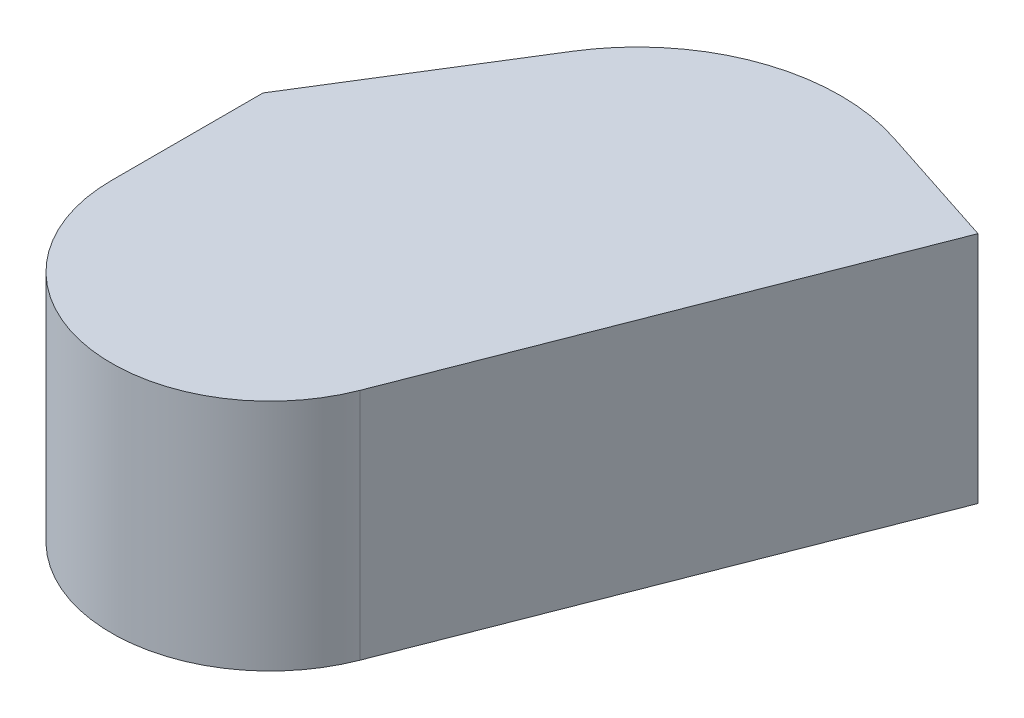
ISO-10303-21;
HEADER;
FILE_DESCRIPTION(('STEP AP214'),'2;1');
FILE_NAME('part.step','',(''),(''),'','','');
FILE_SCHEMA(('AUTOMOTIVE_DESIGN { 1 0 10303 214 1 1 1 1 }'));
ENDSEC;
DATA;
#1=APPLICATION_CONTEXT('core data for automotive mechanical design processes');
#2=APPLICATION_PROTOCOL_DEFINITION('international standard','automotive_design',2000,#1);
#3=PRODUCT_CONTEXT('',#1,'mechanical');
#4=PRODUCT('Part','Part','',(#3));
#5=PRODUCT_RELATED_PRODUCT_CATEGORY('part','',(#4));
#6=PRODUCT_DEFINITION_FORMATION('','',#4);
#7=PRODUCT_DEFINITION_CONTEXT('part definition',#1,'design');
#8=PRODUCT_DEFINITION('design','',#6,#7);
#9=PRODUCT_DEFINITION_SHAPE('','',#8);
#10=(LENGTH_UNIT() NAMED_UNIT(*) SI_UNIT(.MILLI.,.METRE.));
#11=(NAMED_UNIT(*) PLANE_ANGLE_UNIT() SI_UNIT($,.RADIAN.));
#12=(NAMED_UNIT(*) SI_UNIT($,.STERADIAN.) SOLID_ANGLE_UNIT());
#13=UNCERTAINTY_MEASURE_WITH_UNIT(LENGTH_MEASURE(1.E-05),#10,'distance_accuracy_value','');
#14=(GEOMETRIC_REPRESENTATION_CONTEXT(3) GLOBAL_UNCERTAINTY_ASSIGNED_CONTEXT((#13)) GLOBAL_UNIT_ASSIGNED_CONTEXT((#10,
#11,#12)) REPRESENTATION_CONTEXT('',''));
#15=CARTESIAN_POINT('',(0.,0.,0.));
#16=DIRECTION('',(0.,0.,1.));
#17=DIRECTION('',(1.,0.,0.));
#18=AXIS2_PLACEMENT_3D('',#15,#16,#17);
#19=CARTESIAN_POINT('',(-27.0706042753242,0.,37.8486946738408));
#20=DIRECTION('',(0.,-1.,0.));
#21=DIRECTION('',(0.,0.,-1.));
#22=AXIS2_PLACEMENT_3D('',#19,#20,#21);
#23=CYLINDRICAL_SURFACE('',#22,39.60316423643);
#24=DIRECTION('',(0.,-1.,0.));
#25=VECTOR('',#24,1.);
#26=CARTESIAN_POINT('',(-66.6737685117542,58.42,37.8486946738408));
#27=LINE('',#26,#25);
#28=CARTESIAN_POINT('',(-66.6737685117542,0.,37.8486946738408));
#29=VERTEX_POINT('',#28);
#30=CARTESIAN_POINT('',(-66.6737685117542,58.42,37.8486946738408));
#31=VERTEX_POINT('',#30);
#32=EDGE_CURVE('E106',#29,#31,#27,.F.);
#33=ORIENTED_EDGE('',*,*,#32,.F.);
#34=CARTESIAN_POINT('',(-27.0706042753242,0.,37.8486946738408));
#35=DIRECTION('',(0.,-1.,0.));
#36=DIRECTION('',(0.,0.,-1.));
#37=AXIS2_PLACEMENT_3D('',#34,#35,#36);
#38=CIRCLE('',#37,39.60316423643);
#39=CARTESIAN_POINT('',(9.8295367475617,0.,52.2288966901125));
#40=VERTEX_POINT('',#39);
#41=EDGE_CURVE('E50',#40,#29,#38,.T.);
#42=ORIENTED_EDGE('',*,*,#41,.F.);
#43=DIRECTION('',(0.,-1.,0.));
#44=VECTOR('',#43,1.);
#45=CARTESIAN_POINT('',(9.8295367475617,58.42,52.2288966901125));
#46=LINE('',#45,#44);
#47=CARTESIAN_POINT('',(9.8295367475617,58.42,52.2288966901125));
#48=VERTEX_POINT('',#47);
#49=EDGE_CURVE('E138',#48,#40,#46,.T.);
#50=ORIENTED_EDGE('',*,*,#49,.F.);
#51=CARTESIAN_POINT('',(-27.0706042753242,58.42,37.8486946738408));
#52=DIRECTION('',(0.,-1.,0.));
#53=DIRECTION('',(0.,0.,-1.));
#54=AXIS2_PLACEMENT_3D('',#51,#52,#53);
#55=CIRCLE('',#54,39.60316423643);
#56=EDGE_CURVE('E12',#31,#48,#55,.F.);
#57=ORIENTED_EDGE('',*,*,#56,.F.);
#58=EDGE_LOOP('',(#33,#42,#50,#57));
#59=FACE_BOUND('',#58,.T.);
#60=ADVANCED_FACE('F42',(#59),#23,.T.);
#61=CARTESIAN_POINT('',(-66.6737685117542,58.42,0.));
#62=DIRECTION('',(1.,0.,0.));
#63=DIRECTION('',(0.,0.,-1.));
#64=AXIS2_PLACEMENT_3D('',#61,#62,#63);
#65=PLANE('',#64);
#66=DIRECTION('',(0.,0.,1.));
#67=VECTOR('',#66,1.);
#68=CARTESIAN_POINT('',(-66.6737685117542,0.,0.));
#69=LINE('',#68,#67);
#70=CARTESIAN_POINT('',(-66.6737685117542,0.,0.));
#71=VERTEX_POINT('',#70);
#72=EDGE_CURVE('E120',#71,#29,#69,.T.);
#73=ORIENTED_EDGE('',*,*,#72,.T.);
#74=ORIENTED_EDGE('',*,*,#32,.T.);
#75=DIRECTION('',(0.,0.,1.));
#76=VECTOR('',#75,1.);
#77=CARTESIAN_POINT('',(-66.6737685117542,58.42,0.));
#78=LINE('',#77,#76);
#79=CARTESIAN_POINT('',(-66.6737685117542,58.42,0.));
#80=VERTEX_POINT('',#79);
#81=EDGE_CURVE('E97',#80,#31,#78,.T.);
#82=ORIENTED_EDGE('',*,*,#81,.F.);
#83=DIRECTION('',(0.,-1.,0.));
#84=VECTOR('',#83,1.);
#85=CARTESIAN_POINT('',(-66.6737685117542,58.42,0.));
#86=LINE('',#85,#84);
#87=EDGE_CURVE('E119',#80,#71,#86,.T.);
#88=ORIENTED_EDGE('',*,*,#87,.T.);
#89=EDGE_LOOP('',(#73,#74,#82,#88));
#90=FACE_BOUND('',#89,.T.);
#91=ADVANCED_FACE('F145',(#90),#65,.F.);
#92=CARTESIAN_POINT('',(53.1384921973379,58.42,-58.9035172942189));
#93=DIRECTION('',(-0.93174729177176,0.,-0.363107400469877));
#94=DIRECTION('',(-0.363107400469877,0.,0.93174729177176));
#95=AXIS2_PLACEMENT_3D('',#92,#93,#94);
#96=PLANE('',#95);
#97=DIRECTION('',(0.363107400469877,0.,-0.93174729177176));
#98=VECTOR('',#97,1.);
#99=CARTESIAN_POINT('',(53.1384921973379,58.42,-58.9035172942189));
#100=LINE('',#99,#98);
#101=CARTESIAN_POINT('',(53.1384921973379,58.42,-58.9035172942189));
#102=VERTEX_POINT('',#101);
#103=EDGE_CURVE('E90',#48,#102,#100,.T.);
#104=ORIENTED_EDGE('',*,*,#103,.F.);
#105=ORIENTED_EDGE('',*,*,#49,.T.);
#106=DIRECTION('',(0.363107400469877,0.,-0.93174729177176));
#107=VECTOR('',#106,1.);
#108=CARTESIAN_POINT('',(53.1384921973379,0.,-58.9035172942189));
#109=LINE('',#108,#107);
#110=CARTESIAN_POINT('',(53.1384921973379,0.,-58.9035172942189));
#111=VERTEX_POINT('',#110);
#112=EDGE_CURVE('E103',#40,#111,#109,.T.);
#113=ORIENTED_EDGE('',*,*,#112,.T.);
#114=DIRECTION('',(0.,-1.,0.));
#115=VECTOR('',#114,1.);
#116=CARTESIAN_POINT('',(53.1384921973379,58.42,-58.9035172942189));
#117=LINE('',#116,#115);
#118=EDGE_CURVE('E100',#102,#111,#117,.T.);
#119=ORIENTED_EDGE('',*,*,#118,.F.);
#120=EDGE_LOOP('',(#104,#105,#113,#119));
#121=FACE_BOUND('',#120,.T.);
#122=ADVANCED_FACE('F101',(#121),#96,.F.);
#123=CARTESIAN_POINT('',(21.8265277700403,58.42,-69.1139404770334));
#124=DIRECTION('',(-0.310020599830917,0.,0.950729839481479));
#125=DIRECTION('',(0.950729839481479,0.,0.310020599830917));
#126=AXIS2_PLACEMENT_3D('',#123,#124,#125);
#127=PLANE('',#126);
#128=DIRECTION('',(-0.950729839481479,0.,-0.310020599830917));
#129=VECTOR('',#128,1.);
#130=CARTESIAN_POINT('',(21.8265277700403,0.,-69.1139404770334));
#131=LINE('',#130,#129);
#132=CARTESIAN_POINT('',(21.8265277700403,0.,-69.1139404770334));
#133=VERTEX_POINT('',#132);
#134=EDGE_CURVE('E124',#111,#133,#131,.T.);
#135=ORIENTED_EDGE('',*,*,#134,.T.);
#136=DIRECTION('',(0.,-1.,0.));
#137=VECTOR('',#136,1.);
#138=CARTESIAN_POINT('',(21.8265277700403,58.42,-69.1139404770334));
#139=LINE('',#138,#137);
#140=CARTESIAN_POINT('',(21.8265277700403,58.42,-69.1139404770334));
#141=VERTEX_POINT('',#140);
#142=EDGE_CURVE('E107',#141,#133,#139,.T.);
#143=ORIENTED_EDGE('',*,*,#142,.F.);
#144=DIRECTION('',(-0.950729839481479,0.,-0.310020599830917));
#145=VECTOR('',#144,1.);
#146=CARTESIAN_POINT('',(21.8265277700403,58.42,-69.1139404770334));
#147=LINE('',#146,#145);
#148=EDGE_CURVE('E94',#102,#141,#147,.T.);
#149=ORIENTED_EDGE('',*,*,#148,.F.);
#150=ORIENTED_EDGE('',*,*,#118,.T.);
#151=EDGE_LOOP('',(#135,#143,#149,#150));
#152=FACE_BOUND('',#151,.T.);
#153=ADVANCED_FACE('F109',(#152),#127,.F.);
#154=CARTESIAN_POINT('',(6.07748129862949,58.42,-20.8168646313743));
#155=DIRECTION('',(0.,-1.,0.));
#156=DIRECTION('',(0.,0.,-1.));
#157=AXIS2_PLACEMENT_3D('',#154,#155,#156);
#158=CYLINDRICAL_SURFACE('',#157,50.8);
#159=CARTESIAN_POINT('',(6.07748129862949,0.,-20.8168646313743));
#160=DIRECTION('',(0.,1.,0.));
#161=DIRECTION('',(0.,0.,-1.));
#162=AXIS2_PLACEMENT_3D('',#159,#160,#161);
#163=CIRCLE('',#162,50.8);
#164=CARTESIAN_POINT('',(-37.0678218733656,0.,-47.6333299875063));
#165=VERTEX_POINT('',#164);
#166=EDGE_CURVE('E126',#133,#165,#163,.T.);
#167=ORIENTED_EDGE('',*,*,#166,.T.);
#168=DIRECTION('',(0.,-1.,0.));
#169=VECTOR('',#168,1.);
#170=CARTESIAN_POINT('',(-37.0678218733656,58.42,-47.6333299875063));
#171=LINE('',#170,#169);
#172=CARTESIAN_POINT('',(-37.0678218733656,58.42,-47.6333299875063));
#173=VERTEX_POINT('',#172);
#174=EDGE_CURVE('E132',#173,#165,#171,.T.);
#175=ORIENTED_EDGE('',*,*,#174,.F.);
#176=CARTESIAN_POINT('',(6.07748129862949,58.42,-20.8168646313743));
#177=DIRECTION('',(0.,1.,0.));
#178=DIRECTION('',(0.,0.,-1.));
#179=AXIS2_PLACEMENT_3D('',#176,#177,#178);
#180=CIRCLE('',#179,50.8);
#181=EDGE_CURVE('E112',#141,#173,#180,.T.);
#182=ORIENTED_EDGE('',*,*,#181,.F.);
#183=ORIENTED_EDGE('',*,*,#142,.T.);
#184=EDGE_LOOP('',(#167,#175,#182,#183));
#185=FACE_BOUND('',#184,.T.);
#186=ADVANCED_FACE('F153',(#185),#158,.T.);
#187=CARTESIAN_POINT('',(-66.6737685117542,58.42,0.));
#188=DIRECTION('',(0.849316991574704,0.,0.527883176301816));
#189=DIRECTION('',(0.527883176301816,0.,-0.849316991574704));
#190=AXIS2_PLACEMENT_3D('',#187,#188,#189);
#191=PLANE('',#190);
#192=DIRECTION('',(-0.527883176301816,0.,0.849316991574704));
#193=VECTOR('',#192,1.);
#194=CARTESIAN_POINT('',(-66.6737685117542,0.,0.));
#195=LINE('',#194,#193);
#196=EDGE_CURVE('E128',#165,#71,#195,.T.);
#197=ORIENTED_EDGE('',*,*,#196,.T.);
#198=ORIENTED_EDGE('',*,*,#87,.F.);
#199=DIRECTION('',(-0.527883176301816,0.,0.849316991574704));
#200=VECTOR('',#199,1.);
#201=CARTESIAN_POINT('',(-66.6737685117542,58.42,0.));
#202=LINE('',#201,#200);
#203=EDGE_CURVE('E114',#173,#80,#202,.T.);
#204=ORIENTED_EDGE('',*,*,#203,.F.);
#205=ORIENTED_EDGE('',*,*,#174,.T.);
#206=EDGE_LOOP('',(#197,#198,#204,#205));
#207=FACE_BOUND('',#206,.T.);
#208=ADVANCED_FACE('F149',(#207),#191,.F.);
#209=CARTESIAN_POINT('',(6.07748129862949,58.42,-20.8168646313743));
#210=DIRECTION('',(0.,-1.,0.));
#211=DIRECTION('',(0.,0.,-1.));
#212=AXIS2_PLACEMENT_3D('',#209,#210,#211);
#213=PLANE('',#212);
#214=ORIENTED_EDGE('',*,*,#81,.T.);
#215=ORIENTED_EDGE('',*,*,#56,.T.);
#216=ORIENTED_EDGE('',*,*,#103,.T.);
#217=ORIENTED_EDGE('',*,*,#148,.T.);
#218=ORIENTED_EDGE('',*,*,#181,.T.);
#219=ORIENTED_EDGE('',*,*,#203,.T.);
#220=EDGE_LOOP('',(#214,#215,#216,#217,#218,#219));
#221=FACE_BOUND('',#220,.T.);
#222=ADVANCED_FACE('F92',(#221),#213,.F.);
#223=CARTESIAN_POINT('',(6.07748129862949,0.,-20.8168646313743));
#224=DIRECTION('',(0.,-1.,0.));
#225=DIRECTION('',(0.,0.,-1.));
#226=AXIS2_PLACEMENT_3D('',#223,#224,#225);
#227=PLANE('',#226);
#228=ORIENTED_EDGE('',*,*,#112,.F.);
#229=ORIENTED_EDGE('',*,*,#41,.T.);
#230=ORIENTED_EDGE('',*,*,#72,.F.);
#231=ORIENTED_EDGE('',*,*,#196,.F.);
#232=ORIENTED_EDGE('',*,*,#166,.F.);
#233=ORIENTED_EDGE('',*,*,#134,.F.);
#234=EDGE_LOOP('',(#228,#229,#230,#231,#232,#233));
#235=FACE_BOUND('',#234,.T.);
#236=ADVANCED_FACE('F141',(#235),#227,.T.);
#237=CLOSED_SHELL('',(#60,#91,#122,#153,#186,#208,#222,#236));
#238=MANIFOLD_SOLID_BREP('B2',#237);
#239=ADVANCED_BREP_SHAPE_REPRESENTATION('',(#18,#238),#14);
#240=SHAPE_DEFINITION_REPRESENTATION(#9,#239);
ENDSEC;
END-ISO-10303-21;
